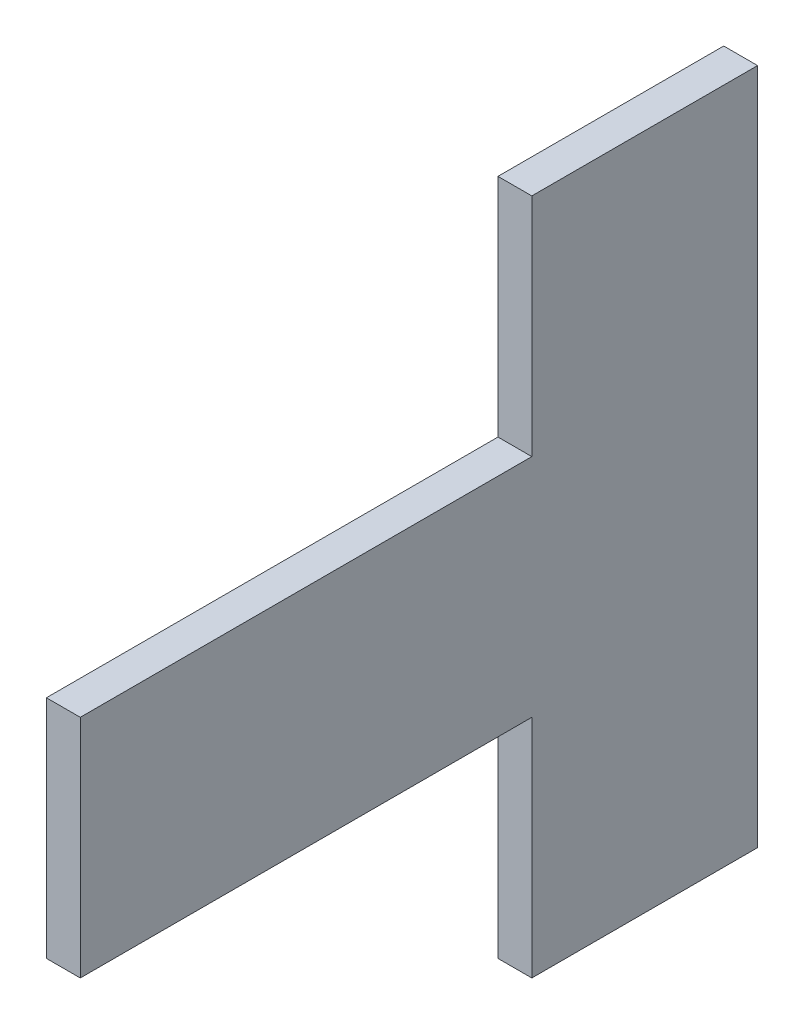
ISO-10303-21;
HEADER;
FILE_DESCRIPTION(('STEP AP214'),'2;1');
FILE_NAME('part.step','',(''),(''),'','','');
FILE_SCHEMA(('AUTOMOTIVE_DESIGN { 1 0 10303 214 1 1 1 1 }'));
ENDSEC;
DATA;
#1=APPLICATION_CONTEXT('core data for automotive mechanical design processes');
#2=APPLICATION_PROTOCOL_DEFINITION('international standard','automotive_design',2000,#1);
#3=PRODUCT_CONTEXT('',#1,'mechanical');
#4=PRODUCT('Part','Part','',(#3));
#5=PRODUCT_RELATED_PRODUCT_CATEGORY('part','',(#4));
#6=PRODUCT_DEFINITION_FORMATION('','',#4);
#7=PRODUCT_DEFINITION_CONTEXT('part definition',#1,'design');
#8=PRODUCT_DEFINITION('design','',#6,#7);
#9=PRODUCT_DEFINITION_SHAPE('','',#8);
#10=(LENGTH_UNIT() NAMED_UNIT(*) SI_UNIT(.MILLI.,.METRE.));
#11=(NAMED_UNIT(*) PLANE_ANGLE_UNIT() SI_UNIT($,.RADIAN.));
#12=(NAMED_UNIT(*) SI_UNIT($,.STERADIAN.) SOLID_ANGLE_UNIT());
#13=UNCERTAINTY_MEASURE_WITH_UNIT(LENGTH_MEASURE(1.E-05),#10,'distance_accuracy_value','');
#14=(GEOMETRIC_REPRESENTATION_CONTEXT(3) GLOBAL_UNCERTAINTY_ASSIGNED_CONTEXT((#13)) GLOBAL_UNIT_ASSIGNED_CONTEXT((#10,
#11,#12)) REPRESENTATION_CONTEXT('',''));
#15=CARTESIAN_POINT('',(0.,0.,0.));
#16=DIRECTION('',(0.,0.,1.));
#17=DIRECTION('',(1.,0.,0.));
#18=AXIS2_PLACEMENT_3D('',#15,#16,#17);
#19=CARTESIAN_POINT('',(3.81,25.4,0.));
#20=DIRECTION('',(0.,0.,-1.));
#21=DIRECTION('',(0.,1.,0.));
#22=AXIS2_PLACEMENT_3D('',#19,#20,#21);
#23=PLANE('',#22);
#24=DIRECTION('',(0.,-1.,0.));
#25=VECTOR('',#24,1.);
#26=CARTESIAN_POINT('',(0.,25.4,0.));
#27=LINE('',#26,#25);
#28=CARTESIAN_POINT('',(0.,25.4,0.));
#29=VERTEX_POINT('',#28);
#30=CARTESIAN_POINT('',(0.,0.,0.));
#31=VERTEX_POINT('',#30);
#32=EDGE_CURVE('E129',#29,#31,#27,.T.);
#33=ORIENTED_EDGE('',*,*,#32,.T.);
#34=DIRECTION('',(-1.,0.,0.));
#35=VECTOR('',#34,1.);
#36=CARTESIAN_POINT('',(3.81,0.,0.));
#37=LINE('',#36,#35);
#38=CARTESIAN_POINT('',(3.81,0.,0.));
#39=VERTEX_POINT('',#38);
#40=EDGE_CURVE('E11',#39,#31,#37,.T.);
#41=ORIENTED_EDGE('',*,*,#40,.F.);
#42=DIRECTION('',(0.,-1.,0.));
#43=VECTOR('',#42,1.);
#44=CARTESIAN_POINT('',(3.81,25.4,0.));
#45=LINE('',#44,#43);
#46=CARTESIAN_POINT('',(3.81,25.4,0.));
#47=VERTEX_POINT('',#46);
#48=EDGE_CURVE('E143',#47,#39,#45,.T.);
#49=ORIENTED_EDGE('',*,*,#48,.F.);
#50=DIRECTION('',(-1.,0.,0.));
#51=VECTOR('',#50,1.);
#52=CARTESIAN_POINT('',(3.81,25.4,0.));
#53=LINE('',#52,#51);
#54=EDGE_CURVE('E125',#47,#29,#53,.T.);
#55=ORIENTED_EDGE('',*,*,#54,.T.);
#56=EDGE_LOOP('',(#33,#41,#49,#55));
#57=FACE_BOUND('',#56,.T.);
#58=ADVANCED_FACE('F33',(#57),#23,.F.);
#59=CARTESIAN_POINT('',(3.81,0.,0.));
#60=DIRECTION('',(0.,-1.,0.));
#61=DIRECTION('',(0.,0.,-1.));
#62=AXIS2_PLACEMENT_3D('',#59,#60,#61);
#63=PLANE('',#62);
#64=DIRECTION('',(0.,0.,1.));
#65=VECTOR('',#64,1.);
#66=CARTESIAN_POINT('',(0.,0.,0.));
#67=LINE('',#66,#65);
#68=CARTESIAN_POINT('',(0.,0.,50.8));
#69=VERTEX_POINT('',#68);
#70=EDGE_CURVE('E132',#31,#69,#67,.T.);
#71=ORIENTED_EDGE('',*,*,#70,.T.);
#72=DIRECTION('',(-1.,0.,0.));
#73=VECTOR('',#72,1.);
#74=CARTESIAN_POINT('',(3.81,0.,50.8));
#75=LINE('',#74,#73);
#76=CARTESIAN_POINT('',(3.81,0.,50.8));
#77=VERTEX_POINT('',#76);
#78=EDGE_CURVE('E41',#77,#69,#75,.T.);
#79=ORIENTED_EDGE('',*,*,#78,.F.);
#80=DIRECTION('',(0.,0.,1.));
#81=VECTOR('',#80,1.);
#82=CARTESIAN_POINT('',(3.81,0.,0.));
#83=LINE('',#82,#81);
#84=EDGE_CURVE('E92',#39,#77,#83,.T.);
#85=ORIENTED_EDGE('',*,*,#84,.F.);
#86=ORIENTED_EDGE('',*,*,#40,.T.);
#87=EDGE_LOOP('',(#71,#79,#85,#86));
#88=FACE_BOUND('',#87,.T.);
#89=ADVANCED_FACE('F178',(#88),#63,.F.);
#90=CARTESIAN_POINT('',(3.81,0.,50.8));
#91=DIRECTION('',(0.,0.,-1.));
#92=DIRECTION('',(-1.,0.,0.));
#93=AXIS2_PLACEMENT_3D('',#90,#91,#92);
#94=PLANE('',#93);
#95=DIRECTION('',(0.,-1.,0.));
#96=VECTOR('',#95,1.);
#97=CARTESIAN_POINT('',(0.,0.,50.8));
#98=LINE('',#97,#96);
#99=CARTESIAN_POINT('',(0.,-25.4,50.8));
#100=VERTEX_POINT('',#99);
#101=EDGE_CURVE('E134',#69,#100,#98,.T.);
#102=ORIENTED_EDGE('',*,*,#101,.T.);
#103=DIRECTION('',(-1.,0.,0.));
#104=VECTOR('',#103,1.);
#105=CARTESIAN_POINT('',(3.81,-25.4,50.8));
#106=LINE('',#105,#104);
#107=CARTESIAN_POINT('',(3.81,-25.4,50.8));
#108=VERTEX_POINT('',#107);
#109=EDGE_CURVE('E150',#108,#100,#106,.T.);
#110=ORIENTED_EDGE('',*,*,#109,.F.);
#111=DIRECTION('',(0.,-1.,0.));
#112=VECTOR('',#111,1.);
#113=CARTESIAN_POINT('',(3.81,0.,50.8));
#114=LINE('',#113,#112);
#115=EDGE_CURVE('E158',#77,#108,#114,.T.);
#116=ORIENTED_EDGE('',*,*,#115,.F.);
#117=ORIENTED_EDGE('',*,*,#78,.T.);
#118=EDGE_LOOP('',(#102,#110,#116,#117));
#119=FACE_BOUND('',#118,.T.);
#120=ADVANCED_FACE('F156',(#119),#94,.F.);
#121=CARTESIAN_POINT('',(3.81,-25.4,50.8));
#122=DIRECTION('',(0.,1.,0.));
#123=DIRECTION('',(0.,0.,1.));
#124=AXIS2_PLACEMENT_3D('',#121,#122,#123);
#125=PLANE('',#124);
#126=DIRECTION('',(0.,0.,-1.));
#127=VECTOR('',#126,1.);
#128=CARTESIAN_POINT('',(0.,-25.4,50.8));
#129=LINE('',#128,#127);
#130=CARTESIAN_POINT('',(0.,-25.4,0.));
#131=VERTEX_POINT('',#130);
#132=EDGE_CURVE('E136',#100,#131,#129,.T.);
#133=ORIENTED_EDGE('',*,*,#132,.T.);
#134=DIRECTION('',(-1.,0.,0.));
#135=VECTOR('',#134,1.);
#136=CARTESIAN_POINT('',(3.81,-25.4,0.));
#137=LINE('',#136,#135);
#138=CARTESIAN_POINT('',(3.81,-25.4,0.));
#139=VERTEX_POINT('',#138);
#140=EDGE_CURVE('E147',#139,#131,#137,.T.);
#141=ORIENTED_EDGE('',*,*,#140,.F.);
#142=DIRECTION('',(0.,0.,-1.));
#143=VECTOR('',#142,1.);
#144=CARTESIAN_POINT('',(3.81,-25.4,50.8));
#145=LINE('',#144,#143);
#146=EDGE_CURVE('E170',#108,#139,#145,.T.);
#147=ORIENTED_EDGE('',*,*,#146,.F.);
#148=ORIENTED_EDGE('',*,*,#109,.T.);
#149=EDGE_LOOP('',(#133,#141,#147,#148));
#150=FACE_BOUND('',#149,.T.);
#151=ADVANCED_FACE('F166',(#150),#125,.F.);
#152=CARTESIAN_POINT('',(3.81,-25.4,0.));
#153=DIRECTION('',(0.,0.,-1.));
#154=DIRECTION('',(0.,1.,0.));
#155=AXIS2_PLACEMENT_3D('',#152,#153,#154);
#156=PLANE('',#155);
#157=DIRECTION('',(0.,-1.,0.));
#158=VECTOR('',#157,1.);
#159=CARTESIAN_POINT('',(0.,-25.4,0.));
#160=LINE('',#159,#158);
#161=CARTESIAN_POINT('',(0.,-50.8,0.));
#162=VERTEX_POINT('',#161);
#163=EDGE_CURVE('E138',#131,#162,#160,.T.);
#164=ORIENTED_EDGE('',*,*,#163,.T.);
#165=DIRECTION('',(-1.,0.,0.));
#166=VECTOR('',#165,1.);
#167=CARTESIAN_POINT('',(3.81,-50.8,0.));
#168=LINE('',#167,#166);
#169=CARTESIAN_POINT('',(3.81,-50.8,0.));
#170=VERTEX_POINT('',#169);
#171=EDGE_CURVE('E120',#170,#162,#168,.T.);
#172=ORIENTED_EDGE('',*,*,#171,.F.);
#173=DIRECTION('',(0.,-1.,0.));
#174=VECTOR('',#173,1.);
#175=CARTESIAN_POINT('',(3.81,-25.4,0.));
#176=LINE('',#175,#174);
#177=EDGE_CURVE('E111',#139,#170,#176,.T.);
#178=ORIENTED_EDGE('',*,*,#177,.F.);
#179=ORIENTED_EDGE('',*,*,#140,.T.);
#180=EDGE_LOOP('',(#164,#172,#178,#179));
#181=FACE_BOUND('',#180,.T.);
#182=ADVANCED_FACE('F169',(#181),#156,.F.);
#183=CARTESIAN_POINT('',(3.81,-50.8,0.));
#184=DIRECTION('',(0.,1.,0.));
#185=DIRECTION('',(0.,0.,1.));
#186=AXIS2_PLACEMENT_3D('',#183,#184,#185);
#187=PLANE('',#186);
#188=DIRECTION('',(0.,0.,-1.));
#189=VECTOR('',#188,1.);
#190=CARTESIAN_POINT('',(0.,-50.8,0.));
#191=LINE('',#190,#189);
#192=CARTESIAN_POINT('',(0.,-50.8,-25.4));
#193=VERTEX_POINT('',#192);
#194=EDGE_CURVE('E119',#162,#193,#191,.T.);
#195=ORIENTED_EDGE('',*,*,#194,.T.);
#196=DIRECTION('',(-1.,0.,0.));
#197=VECTOR('',#196,1.);
#198=CARTESIAN_POINT('',(3.81,-50.8,-25.4));
#199=LINE('',#198,#197);
#200=CARTESIAN_POINT('',(3.81,-50.8,-25.4));
#201=VERTEX_POINT('',#200);
#202=EDGE_CURVE('E116',#201,#193,#199,.T.);
#203=ORIENTED_EDGE('',*,*,#202,.F.);
#204=DIRECTION('',(0.,0.,-1.));
#205=VECTOR('',#204,1.);
#206=CARTESIAN_POINT('',(3.81,-50.8,0.));
#207=LINE('',#206,#205);
#208=EDGE_CURVE('E105',#170,#201,#207,.T.);
#209=ORIENTED_EDGE('',*,*,#208,.F.);
#210=ORIENTED_EDGE('',*,*,#171,.T.);
#211=EDGE_LOOP('',(#195,#203,#209,#210));
#212=FACE_BOUND('',#211,.T.);
#213=ADVANCED_FACE('F117',(#212),#187,.F.);
#214=CARTESIAN_POINT('',(3.81,-50.8,-25.4));
#215=DIRECTION('',(0.,0.,1.));
#216=DIRECTION('',(0.,-1.,0.));
#217=AXIS2_PLACEMENT_3D('',#214,#215,#216);
#218=PLANE('',#217);
#219=DIRECTION('',(0.,1.,0.));
#220=VECTOR('',#219,1.);
#221=CARTESIAN_POINT('',(0.,-50.8,-25.4));
#222=LINE('',#221,#220);
#223=CARTESIAN_POINT('',(0.,25.4,-25.4));
#224=VERTEX_POINT('',#223);
#225=EDGE_CURVE('E78',#193,#224,#222,.T.);
#226=ORIENTED_EDGE('',*,*,#225,.T.);
#227=DIRECTION('',(-1.,0.,0.));
#228=VECTOR('',#227,1.);
#229=CARTESIAN_POINT('',(3.81,25.4,-25.4));
#230=LINE('',#229,#228);
#231=CARTESIAN_POINT('',(3.81,25.4,-25.4));
#232=VERTEX_POINT('',#231);
#233=EDGE_CURVE('E121',#232,#224,#230,.T.);
#234=ORIENTED_EDGE('',*,*,#233,.F.);
#235=DIRECTION('',(0.,1.,0.));
#236=VECTOR('',#235,1.);
#237=CARTESIAN_POINT('',(3.81,-50.8,-25.4));
#238=LINE('',#237,#236);
#239=EDGE_CURVE('E109',#201,#232,#238,.T.);
#240=ORIENTED_EDGE('',*,*,#239,.F.);
#241=ORIENTED_EDGE('',*,*,#202,.T.);
#242=EDGE_LOOP('',(#226,#234,#240,#241));
#243=FACE_BOUND('',#242,.T.);
#244=ADVANCED_FACE('F123',(#243),#218,.F.);
#245=CARTESIAN_POINT('',(3.81,25.4,-25.4));
#246=DIRECTION('',(0.,-1.,0.));
#247=DIRECTION('',(0.,0.,-1.));
#248=AXIS2_PLACEMENT_3D('',#245,#246,#247);
#249=PLANE('',#248);
#250=DIRECTION('',(0.,0.,1.));
#251=VECTOR('',#250,1.);
#252=CARTESIAN_POINT('',(0.,25.4,-25.4));
#253=LINE('',#252,#251);
#254=EDGE_CURVE('E84',#224,#29,#253,.T.);
#255=ORIENTED_EDGE('',*,*,#254,.T.);
#256=ORIENTED_EDGE('',*,*,#54,.F.);
#257=DIRECTION('',(0.,0.,1.));
#258=VECTOR('',#257,1.);
#259=CARTESIAN_POINT('',(3.81,25.4,-25.4));
#260=LINE('',#259,#258);
#261=EDGE_CURVE('E49',#232,#47,#260,.T.);
#262=ORIENTED_EDGE('',*,*,#261,.F.);
#263=ORIENTED_EDGE('',*,*,#233,.T.);
#264=EDGE_LOOP('',(#255,#256,#262,#263));
#265=FACE_BOUND('',#264,.T.);
#266=ADVANCED_FACE('F194',(#265),#249,.F.);
#267=CARTESIAN_POINT('',(3.81,0.,0.));
#268=DIRECTION('',(-1.,0.,0.));
#269=DIRECTION('',(0.,0.,1.));
#270=AXIS2_PLACEMENT_3D('',#267,#268,#269);
#271=PLANE('',#270);
#272=ORIENTED_EDGE('',*,*,#48,.T.);
#273=ORIENTED_EDGE('',*,*,#84,.T.);
#274=ORIENTED_EDGE('',*,*,#115,.T.);
#275=ORIENTED_EDGE('',*,*,#146,.T.);
#276=ORIENTED_EDGE('',*,*,#177,.T.);
#277=ORIENTED_EDGE('',*,*,#208,.T.);
#278=ORIENTED_EDGE('',*,*,#239,.T.);
#279=ORIENTED_EDGE('',*,*,#261,.T.);
#280=EDGE_LOOP('',(#272,#273,#274,#275,#276,#277,#278,#279));
#281=FACE_BOUND('',#280,.T.);
#282=ADVANCED_FACE('F107',(#281),#271,.F.);
#283=CARTESIAN_POINT('',(0.,0.,0.));
#284=DIRECTION('',(-1.,0.,0.));
#285=DIRECTION('',(0.,0.,1.));
#286=AXIS2_PLACEMENT_3D('',#283,#284,#285);
#287=PLANE('',#286);
#288=ORIENTED_EDGE('',*,*,#32,.F.);
#289=ORIENTED_EDGE('',*,*,#254,.F.);
#290=ORIENTED_EDGE('',*,*,#225,.F.);
#291=ORIENTED_EDGE('',*,*,#194,.F.);
#292=ORIENTED_EDGE('',*,*,#163,.F.);
#293=ORIENTED_EDGE('',*,*,#132,.F.);
#294=ORIENTED_EDGE('',*,*,#101,.F.);
#295=ORIENTED_EDGE('',*,*,#70,.F.);
#296=EDGE_LOOP('',(#288,#289,#290,#291,#292,#293,#294,#295));
#297=FACE_BOUND('',#296,.T.);
#298=ADVANCED_FACE('F162',(#297),#287,.T.);
#299=CLOSED_SHELL('',(#58,#89,#120,#151,#182,#213,#244,#266,#282,#298));
#300=MANIFOLD_SOLID_BREP('B2',#299);
#301=ADVANCED_BREP_SHAPE_REPRESENTATION('',(#18,#300),#14);
#302=SHAPE_DEFINITION_REPRESENTATION(#9,#301);
ENDSEC;
END-ISO-10303-21;
